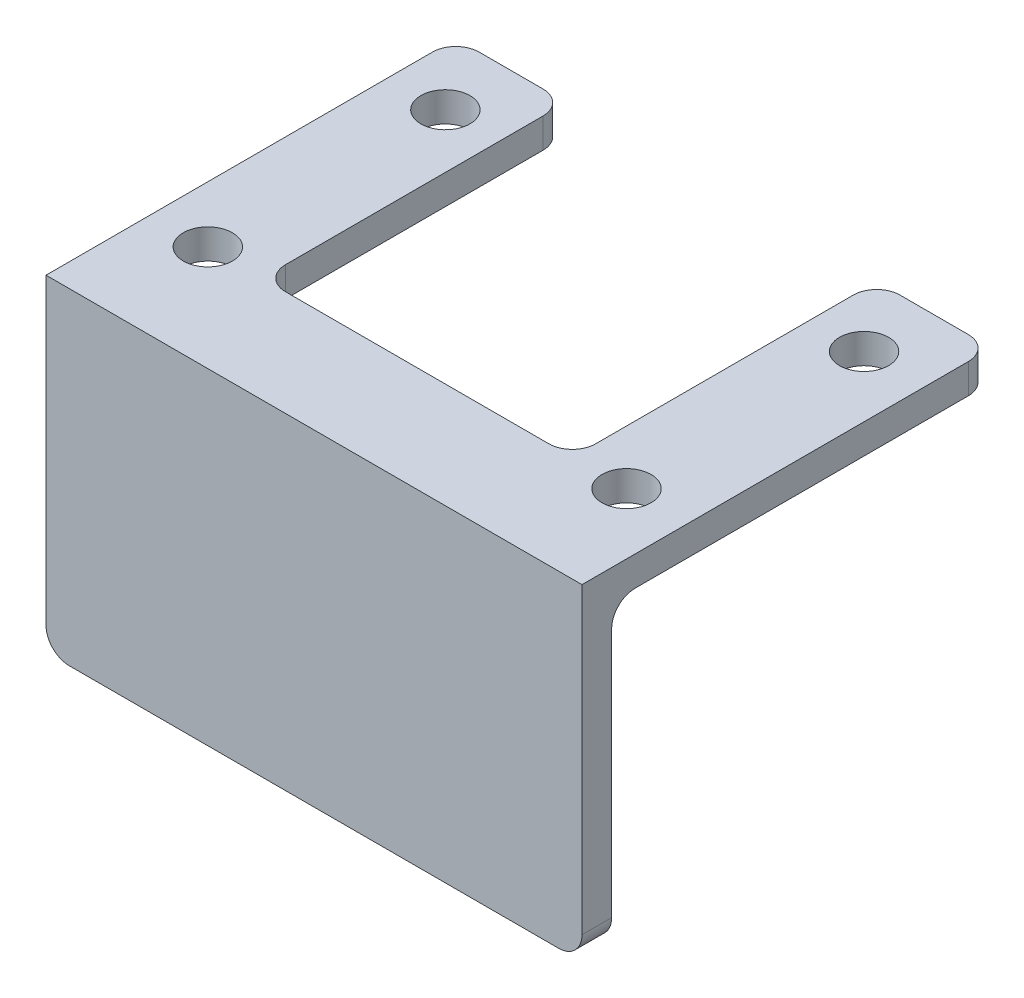
ISO-10303-21;
HEADER;
FILE_DESCRIPTION(('STEP AP214'),'2;1');
FILE_NAME('part.step','',(''),(''),'','','');
FILE_SCHEMA(('AUTOMOTIVE_DESIGN { 1 0 10303 214 1 1 1 1 }'));
ENDSEC;
DATA;
#1=APPLICATION_CONTEXT('core data for automotive mechanical design processes');
#2=APPLICATION_PROTOCOL_DEFINITION('international standard','automotive_design',2000,#1);
#3=PRODUCT_CONTEXT('',#1,'mechanical');
#4=PRODUCT('Part','Part','',(#3));
#5=PRODUCT_RELATED_PRODUCT_CATEGORY('part','',(#4));
#6=PRODUCT_DEFINITION_FORMATION('','',#4);
#7=PRODUCT_DEFINITION_CONTEXT('part definition',#1,'design');
#8=PRODUCT_DEFINITION('design','',#6,#7);
#9=PRODUCT_DEFINITION_SHAPE('','',#8);
#10=(LENGTH_UNIT() NAMED_UNIT(*) SI_UNIT(.MILLI.,.METRE.));
#11=(NAMED_UNIT(*) PLANE_ANGLE_UNIT() SI_UNIT($,.RADIAN.));
#12=(NAMED_UNIT(*) SI_UNIT($,.STERADIAN.) SOLID_ANGLE_UNIT());
#13=UNCERTAINTY_MEASURE_WITH_UNIT(LENGTH_MEASURE(1.E-05),#10,'distance_accuracy_value','');
#14=(GEOMETRIC_REPRESENTATION_CONTEXT(3) GLOBAL_UNCERTAINTY_ASSIGNED_CONTEXT((#13)) GLOBAL_UNIT_ASSIGNED_CONTEXT((#10,
#11,#12)) REPRESENTATION_CONTEXT('',''));
#15=CARTESIAN_POINT('',(0.,0.,0.));
#16=DIRECTION('',(0.,0.,1.));
#17=DIRECTION('',(1.,0.,0.));
#18=AXIS2_PLACEMENT_3D('',#15,#16,#17);
#19=CARTESIAN_POINT('',(0.,2.54,0.));
#20=DIRECTION('',(0.,1.,0.));
#21=DIRECTION('',(0.,0.,1.));
#22=AXIS2_PLACEMENT_3D('',#19,#20,#21);
#23=PLANE('',#22);
#24=CARTESIAN_POINT('',(56.209107250434,2.54,-23.3955963790764));
#25=DIRECTION('',(0.,1.,0.));
#26=DIRECTION('',(0.,0.,1.));
#27=AXIS2_PLACEMENT_3D('',#24,#25,#26);
#28=CIRCLE('',#27,2.09999999999999);
#29=CARTESIAN_POINT('',(56.209107250434,2.54,-21.2955963790764));
#30=VERTEX_POINT('',#29);
#31=EDGE_CURVE('E229',#30,#30,#28,.T.);
#32=ORIENTED_EDGE('',*,*,#31,.F.);
#33=EDGE_LOOP('',(#32));
#34=FACE_BOUND('',#33,.T.);
#35=CARTESIAN_POINT('',(20.395107250434,2.54,-23.3955963790764));
#36=DIRECTION('',(0.,1.,0.));
#37=DIRECTION('',(0.,0.,1.));
#38=AXIS2_PLACEMENT_3D('',#35,#36,#37);
#39=CIRCLE('',#38,2.1);
#40=CARTESIAN_POINT('',(20.395107250434,2.54,-21.2955963790764));
#41=VERTEX_POINT('',#40);
#42=EDGE_CURVE('E245',#41,#41,#39,.T.);
#43=ORIENTED_EDGE('',*,*,#42,.F.);
#44=EDGE_LOOP('',(#43));
#45=FACE_BOUND('',#44,.T.);
#46=DIRECTION('',(0.,0.,-1.));
#47=VECTOR('',#46,1.);
#48=CARTESIAN_POINT('',(61.4161118891041,2.54,3.40140328523063));
#49=LINE('',#48,#47);
#50=CARTESIAN_POINT('',(61.4161118891041,2.54,5.94140328523064));
#51=VERTEX_POINT('',#50);
#52=CARTESIAN_POINT('',(61.4161118891041,2.54,-27.1105972946034));
#53=VERTEX_POINT('',#52);
#54=EDGE_CURVE('E174',#51,#53,#49,.T.);
#55=ORIENTED_EDGE('',*,*,#54,.T.);
#56=CARTESIAN_POINT('',(59.4161118891041,2.54,-27.1105972946034));
#57=DIRECTION('',(0.,1.,0.));
#58=DIRECTION('',(0.,0.,1.));
#59=AXIS2_PLACEMENT_3D('',#56,#57,#58);
#60=CIRCLE('',#59,2.);
#61=CARTESIAN_POINT('',(59.4161118891041,2.54,-29.1105972946034));
#62=VERTEX_POINT('',#61);
#63=EDGE_CURVE('E362',#53,#62,#60,.T.);
#64=ORIENTED_EDGE('',*,*,#63,.T.);
#65=DIRECTION('',(-1.,0.,0.));
#66=VECTOR('',#65,1.);
#67=CARTESIAN_POINT('',(51.5691072504341,2.54,-29.1105972946034));
#68=LINE('',#67,#66);
#69=CARTESIAN_POINT('',(53.5691072504341,2.54,-29.1105972946034));
#70=VERTEX_POINT('',#69);
#71=EDGE_CURVE('E185',#62,#70,#68,.T.);
#72=ORIENTED_EDGE('',*,*,#71,.T.);
#73=CARTESIAN_POINT('',(53.5691072504341,2.54,-27.1105972946034));
#74=DIRECTION('',(0.,1.,0.));
#75=DIRECTION('',(0.,0.,1.));
#76=AXIS2_PLACEMENT_3D('',#73,#74,#75);
#77=CIRCLE('',#76,2.);
#78=CARTESIAN_POINT('',(51.5691072504341,2.54,-27.1105972946034));
#79=VERTEX_POINT('',#78);
#80=EDGE_CURVE('E359',#70,#79,#77,.T.);
#81=ORIENTED_EDGE('',*,*,#80,.T.);
#82=DIRECTION('',(0.,0.,1.));
#83=VECTOR('',#82,1.);
#84=CARTESIAN_POINT('',(51.5691072504341,2.54,-29.1105972946034));
#85=LINE('',#84,#83);
#86=CARTESIAN_POINT('',(51.5691072504341,2.54,-5.07559637907637));
#87=VERTEX_POINT('',#86);
#88=EDGE_CURVE('E259',#79,#87,#85,.T.);
#89=ORIENTED_EDGE('',*,*,#88,.T.);
#90=CARTESIAN_POINT('',(49.5691072504341,2.54,-5.07559637907637));
#91=DIRECTION('',(0.,1.,0.));
#92=DIRECTION('',(0.,0.,1.));
#93=AXIS2_PLACEMENT_3D('',#90,#91,#92);
#94=CIRCLE('',#93,2.);
#95=CARTESIAN_POINT('',(49.5691072504341,2.54,-3.07559637907637));
#96=VERTEX_POINT('',#95);
#97=EDGE_CURVE('E401',#87,#96,#94,.F.);
#98=ORIENTED_EDGE('',*,*,#97,.T.);
#99=DIRECTION('',(-1.,0.,0.));
#100=VECTOR('',#99,1.);
#101=CARTESIAN_POINT('',(25.035107250434,2.54,-3.07559637907637));
#102=LINE('',#101,#100);
#103=CARTESIAN_POINT('',(27.0351072504341,2.54,-3.07559637907637));
#104=VERTEX_POINT('',#103);
#105=EDGE_CURVE('E263',#96,#104,#102,.T.);
#106=ORIENTED_EDGE('',*,*,#105,.T.);
#107=CARTESIAN_POINT('',(27.0351072504341,2.54,-5.07559637907637));
#108=DIRECTION('',(0.,1.,0.));
#109=DIRECTION('',(0.,0.,1.));
#110=AXIS2_PLACEMENT_3D('',#107,#108,#109);
#111=CIRCLE('',#110,2.);
#112=CARTESIAN_POINT('',(25.035107250434,2.54,-5.07559637907637));
#113=VERTEX_POINT('',#112);
#114=EDGE_CURVE('E11',#104,#113,#111,.F.);
#115=ORIENTED_EDGE('',*,*,#114,.T.);
#116=DIRECTION('',(0.,0.,-1.));
#117=VECTOR('',#116,1.);
#118=CARTESIAN_POINT('',(25.035107250434,2.54,-29.1105972946034));
#119=LINE('',#118,#117);
#120=CARTESIAN_POINT('',(25.035107250434,2.54,-27.1105972946034));
#121=VERTEX_POINT('',#120);
#122=EDGE_CURVE('E267',#113,#121,#119,.T.);
#123=ORIENTED_EDGE('',*,*,#122,.T.);
#124=CARTESIAN_POINT('',(23.035107250434,2.54,-27.1105972946034));
#125=DIRECTION('',(0.,1.,0.));
#126=DIRECTION('',(0.,0.,1.));
#127=AXIS2_PLACEMENT_3D('',#124,#125,#126);
#128=CIRCLE('',#127,2.);
#129=CARTESIAN_POINT('',(23.035107250434,2.54,-29.1105972946034));
#130=VERTEX_POINT('',#129);
#131=EDGE_CURVE('E64',#121,#130,#128,.T.);
#132=ORIENTED_EDGE('',*,*,#131,.T.);
#133=DIRECTION('',(-1.,0.,0.));
#134=VECTOR('',#133,1.);
#135=CARTESIAN_POINT('',(15.5691041376411,2.54,-29.1105972946034));
#136=LINE('',#135,#134);
#137=CARTESIAN_POINT('',(17.569104137641,2.54,-29.1105972946034));
#138=VERTEX_POINT('',#137);
#139=EDGE_CURVE('E270',#130,#138,#136,.T.);
#140=ORIENTED_EDGE('',*,*,#139,.T.);
#141=CARTESIAN_POINT('',(17.569104137641,2.54,-27.1105972946034));
#142=DIRECTION('',(0.,1.,0.));
#143=DIRECTION('',(0.,0.,1.));
#144=AXIS2_PLACEMENT_3D('',#141,#142,#143);
#145=CIRCLE('',#144,2.);
#146=CARTESIAN_POINT('',(15.5691041376411,2.54,-27.1105972946034));
#147=VERTEX_POINT('',#146);
#148=EDGE_CURVE('E354',#138,#147,#145,.T.);
#149=ORIENTED_EDGE('',*,*,#148,.T.);
#150=DIRECTION('',(0.,0.,1.));
#151=VECTOR('',#150,1.);
#152=CARTESIAN_POINT('',(15.5691041376411,2.54,-29.1105972946034));
#153=LINE('',#152,#151);
#154=CARTESIAN_POINT('',(15.5691041376411,2.54,5.94140328523064));
#155=VERTEX_POINT('',#154);
#156=EDGE_CURVE('E186',#147,#155,#153,.T.);
#157=ORIENTED_EDGE('',*,*,#156,.T.);
#158=DIRECTION('',(-1.,0.,0.));
#159=VECTOR('',#158,1.);
#160=CARTESIAN_POINT('',(15.5691041376411,2.54,5.94140328523064));
#161=LINE('',#160,#159);
#162=EDGE_CURVE('E192',#51,#155,#161,.T.);
#163=ORIENTED_EDGE('',*,*,#162,.F.);
#164=EDGE_LOOP('',(#55,#64,#72,#81,#89,#98,#106,#115,#123,#132,#140,#149,#157,#163));
#165=FACE_BOUND('',#164,.T.);
#166=CARTESIAN_POINT('',(20.395107250434,2.54,-3.07559637907637));
#167=DIRECTION('',(0.,1.,0.));
#168=DIRECTION('',(0.,0.,1.));
#169=AXIS2_PLACEMENT_3D('',#166,#167,#168);
#170=CIRCLE('',#169,2.1);
#171=CARTESIAN_POINT('',(20.395107250434,2.54,-0.975596379076362));
#172=VERTEX_POINT('',#171);
#173=EDGE_CURVE('E237',#172,#172,#170,.T.);
#174=ORIENTED_EDGE('',*,*,#173,.F.);
#175=EDGE_LOOP('',(#174));
#176=FACE_BOUND('',#175,.T.);
#177=CARTESIAN_POINT('',(56.209107250434,2.54,-3.07559637907637));
#178=DIRECTION('',(0.,1.,0.));
#179=DIRECTION('',(0.,0.,1.));
#180=AXIS2_PLACEMENT_3D('',#177,#178,#179);
#181=CIRCLE('',#180,2.09999999999999);
#182=CARTESIAN_POINT('',(56.209107250434,2.54,-0.975596379076378));
#183=VERTEX_POINT('',#182);
#184=EDGE_CURVE('E221',#183,#183,#181,.T.);
#185=ORIENTED_EDGE('',*,*,#184,.F.);
#186=EDGE_LOOP('',(#185));
#187=FACE_BOUND('',#186,.T.);
#188=ADVANCED_FACE('F41',(#34,#45,#165,#176,#187),#23,.T.);
#189=CARTESIAN_POINT('',(0.,0.,0.));
#190=DIRECTION('',(0.,1.,0.));
#191=DIRECTION('',(0.,0.,1.));
#192=AXIS2_PLACEMENT_3D('',#189,#190,#191);
#193=PLANE('',#192);
#194=DIRECTION('',(0.,0.,-1.));
#195=VECTOR('',#194,1.);
#196=CARTESIAN_POINT('',(61.4161118891041,0.,-29.1105972946034));
#197=LINE('',#196,#195);
#198=CARTESIAN_POINT('',(61.4161118891041,0.,1.40140328523063));
#199=VERTEX_POINT('',#198);
#200=CARTESIAN_POINT('',(61.4161118891041,0.,-27.1105972946034));
#201=VERTEX_POINT('',#200);
#202=EDGE_CURVE('E277',#199,#201,#197,.T.);
#203=ORIENTED_EDGE('',*,*,#202,.F.);
#204=DIRECTION('',(1.,0.,0.));
#205=VECTOR('',#204,1.);
#206=CARTESIAN_POINT('',(0.,0.,1.40140328523064));
#207=LINE('',#206,#205);
#208=CARTESIAN_POINT('',(15.569104137641,0.,1.40140328523064));
#209=VERTEX_POINT('',#208);
#210=EDGE_CURVE('E344',#199,#209,#207,.F.);
#211=ORIENTED_EDGE('',*,*,#210,.T.);
#212=DIRECTION('',(0.,0.,1.));
#213=VECTOR('',#212,1.);
#214=CARTESIAN_POINT('',(15.5691041376411,0.,2.13140328523063));
#215=LINE('',#214,#213);
#216=CARTESIAN_POINT('',(15.569104137641,0.,-27.1105972946034));
#217=VERTEX_POINT('',#216);
#218=EDGE_CURVE('E249',#217,#209,#215,.T.);
#219=ORIENTED_EDGE('',*,*,#218,.F.);
#220=CARTESIAN_POINT('',(17.569104137641,0.,-27.1105972946034));
#221=DIRECTION('',(0.,1.,0.));
#222=DIRECTION('',(0.,0.,1.));
#223=AXIS2_PLACEMENT_3D('',#220,#221,#222);
#224=CIRCLE('',#223,2.);
#225=CARTESIAN_POINT('',(17.569104137641,0.,-29.1105972946034));
#226=VERTEX_POINT('',#225);
#227=EDGE_CURVE('E332',#217,#226,#224,.F.);
#228=ORIENTED_EDGE('',*,*,#227,.T.);
#229=DIRECTION('',(-1.,0.,0.));
#230=VECTOR('',#229,1.);
#231=CARTESIAN_POINT('',(15.5691041376411,0.,-29.1105972946034));
#232=LINE('',#231,#230);
#233=CARTESIAN_POINT('',(23.035107250434,0.,-29.1105972946034));
#234=VERTEX_POINT('',#233);
#235=EDGE_CURVE('E254',#234,#226,#232,.T.);
#236=ORIENTED_EDGE('',*,*,#235,.F.);
#237=CARTESIAN_POINT('',(23.035107250434,0.,-27.1105972946034));
#238=DIRECTION('',(0.,1.,0.));
#239=DIRECTION('',(0.,0.,1.));
#240=AXIS2_PLACEMENT_3D('',#237,#238,#239);
#241=CIRCLE('',#240,2.);
#242=CARTESIAN_POINT('',(25.035107250434,0.,-27.1105972946034));
#243=VERTEX_POINT('',#242);
#244=EDGE_CURVE('E335',#234,#243,#241,.F.);
#245=ORIENTED_EDGE('',*,*,#244,.T.);
#246=DIRECTION('',(0.,0.,-1.));
#247=VECTOR('',#246,1.);
#248=CARTESIAN_POINT('',(25.035107250434,0.,-29.1105972946034));
#249=LINE('',#248,#247);
#250=CARTESIAN_POINT('',(25.035107250434,0.,-5.07559637907637));
#251=VERTEX_POINT('',#250);
#252=EDGE_CURVE('E292',#251,#243,#249,.T.);
#253=ORIENTED_EDGE('',*,*,#252,.F.);
#254=CARTESIAN_POINT('',(27.0351072504341,0.,-5.07559637907637));
#255=DIRECTION('',(0.,1.,0.));
#256=DIRECTION('',(0.,0.,1.));
#257=AXIS2_PLACEMENT_3D('',#254,#255,#256);
#258=CIRCLE('',#257,2.);
#259=CARTESIAN_POINT('',(27.0351072504341,0.,-3.07559637907637));
#260=VERTEX_POINT('',#259);
#261=EDGE_CURVE('E50',#251,#260,#258,.T.);
#262=ORIENTED_EDGE('',*,*,#261,.T.);
#263=DIRECTION('',(-1.,0.,0.));
#264=VECTOR('',#263,1.);
#265=CARTESIAN_POINT('',(25.035107250434,0.,-3.07559637907637));
#266=LINE('',#265,#264);
#267=CARTESIAN_POINT('',(49.5691072504341,0.,-3.07559637907637));
#268=VERTEX_POINT('',#267);
#269=EDGE_CURVE('E288',#268,#260,#266,.T.);
#270=ORIENTED_EDGE('',*,*,#269,.F.);
#271=CARTESIAN_POINT('',(49.5691072504341,0.,-5.07559637907637));
#272=DIRECTION('',(0.,1.,0.));
#273=DIRECTION('',(0.,0.,1.));
#274=AXIS2_PLACEMENT_3D('',#271,#272,#273);
#275=CIRCLE('',#274,2.);
#276=CARTESIAN_POINT('',(51.5691072504341,0.,-5.07559637907637));
#277=VERTEX_POINT('',#276);
#278=EDGE_CURVE('E398',#268,#277,#275,.T.);
#279=ORIENTED_EDGE('',*,*,#278,.T.);
#280=DIRECTION('',(0.,0.,1.));
#281=VECTOR('',#280,1.);
#282=CARTESIAN_POINT('',(51.5691072504341,0.,-29.1105972946034));
#283=LINE('',#282,#281);
#284=CARTESIAN_POINT('',(51.5691072504341,0.,-27.1105972946034));
#285=VERTEX_POINT('',#284);
#286=EDGE_CURVE('E284',#285,#277,#283,.T.);
#287=ORIENTED_EDGE('',*,*,#286,.F.);
#288=CARTESIAN_POINT('',(53.5691072504341,0.,-27.1105972946034));
#289=DIRECTION('',(0.,1.,0.));
#290=DIRECTION('',(0.,0.,1.));
#291=AXIS2_PLACEMENT_3D('',#288,#289,#290);
#292=CIRCLE('',#291,2.);
#293=CARTESIAN_POINT('',(53.5691072504341,0.,-29.1105972946034));
#294=VERTEX_POINT('',#293);
#295=EDGE_CURVE('E338',#285,#294,#292,.F.);
#296=ORIENTED_EDGE('',*,*,#295,.T.);
#297=DIRECTION('',(-1.,0.,0.));
#298=VECTOR('',#297,1.);
#299=CARTESIAN_POINT('',(51.5691072504341,0.,-29.1105972946034));
#300=LINE('',#299,#298);
#301=CARTESIAN_POINT('',(59.4161118891041,0.,-29.1105972946034));
#302=VERTEX_POINT('',#301);
#303=EDGE_CURVE('E280',#302,#294,#300,.T.);
#304=ORIENTED_EDGE('',*,*,#303,.F.);
#305=CARTESIAN_POINT('',(59.4161118891041,0.,-27.1105972946034));
#306=DIRECTION('',(0.,1.,0.));
#307=DIRECTION('',(0.,0.,1.));
#308=AXIS2_PLACEMENT_3D('',#305,#306,#307);
#309=CIRCLE('',#308,2.);
#310=EDGE_CURVE('E341',#302,#201,#309,.F.);
#311=ORIENTED_EDGE('',*,*,#310,.T.);
#312=EDGE_LOOP('',(#203,#211,#219,#228,#236,#245,#253,#262,#270,#279,#287,#296,#304,#311));
#313=FACE_BOUND('',#312,.T.);
#314=CARTESIAN_POINT('',(20.395107250434,0.,-23.3955963790764));
#315=DIRECTION('',(0.,1.,0.));
#316=DIRECTION('',(0.,0.,1.));
#317=AXIS2_PLACEMENT_3D('',#314,#315,#316);
#318=CIRCLE('',#317,2.1);
#319=CARTESIAN_POINT('',(20.395107250434,0.,-21.2955963790764));
#320=VERTEX_POINT('',#319);
#321=EDGE_CURVE('E241',#320,#320,#318,.T.);
#322=ORIENTED_EDGE('',*,*,#321,.T.);
#323=EDGE_LOOP('',(#322));
#324=FACE_BOUND('',#323,.T.);
#325=CARTESIAN_POINT('',(20.395107250434,0.,-3.07559637907637));
#326=DIRECTION('',(0.,1.,0.));
#327=DIRECTION('',(0.,0.,1.));
#328=AXIS2_PLACEMENT_3D('',#325,#326,#327);
#329=CIRCLE('',#328,2.1);
#330=CARTESIAN_POINT('',(20.395107250434,0.,-0.975596379076362));
#331=VERTEX_POINT('',#330);
#332=EDGE_CURVE('E233',#331,#331,#329,.T.);
#333=ORIENTED_EDGE('',*,*,#332,.T.);
#334=EDGE_LOOP('',(#333));
#335=FACE_BOUND('',#334,.T.);
#336=CARTESIAN_POINT('',(56.209107250434,0.,-23.3955963790764));
#337=DIRECTION('',(0.,1.,0.));
#338=DIRECTION('',(0.,0.,1.));
#339=AXIS2_PLACEMENT_3D('',#336,#337,#338);
#340=CIRCLE('',#339,2.09999999999999);
#341=CARTESIAN_POINT('',(56.209107250434,0.,-21.2955963790764));
#342=VERTEX_POINT('',#341);
#343=EDGE_CURVE('E225',#342,#342,#340,.T.);
#344=ORIENTED_EDGE('',*,*,#343,.T.);
#345=EDGE_LOOP('',(#344));
#346=FACE_BOUND('',#345,.T.);
#347=CARTESIAN_POINT('',(56.209107250434,0.,-3.07559637907637));
#348=DIRECTION('',(0.,1.,0.));
#349=DIRECTION('',(0.,0.,1.));
#350=AXIS2_PLACEMENT_3D('',#347,#348,#349);
#351=CIRCLE('',#350,2.09999999999999);
#352=CARTESIAN_POINT('',(56.209107250434,0.,-0.975596379076378));
#353=VERTEX_POINT('',#352);
#354=EDGE_CURVE('E216',#353,#353,#351,.T.);
#355=ORIENTED_EDGE('',*,*,#354,.T.);
#356=EDGE_LOOP('',(#355));
#357=FACE_BOUND('',#356,.T.);
#358=ADVANCED_FACE('F408',(#313,#324,#335,#346,#357),#193,.F.);
#359=CARTESIAN_POINT('',(15.5691041376411,2.54,2.13140328523063));
#360=DIRECTION('',(1.,0.,0.));
#361=DIRECTION('',(0.,0.,-1.));
#362=AXIS2_PLACEMENT_3D('',#359,#360,#361);
#363=PLANE('',#362);
#364=DIRECTION('',(0.,-1.,0.));
#365=VECTOR('',#364,1.);
#366=CARTESIAN_POINT('',(15.5691041376411,2.54,3.40140328523063));
#367=LINE('',#366,#365);
#368=CARTESIAN_POINT('',(15.5691041376411,-2.,3.40140328523063));
#369=VERTEX_POINT('',#368);
#370=CARTESIAN_POINT('',(15.5691041376411,-23.4,3.40140328523063));
#371=VERTEX_POINT('',#370);
#372=EDGE_CURVE('E203',#369,#371,#367,.T.);
#373=ORIENTED_EDGE('',*,*,#372,.T.);
#374=DIRECTION('',(0.,0.,-1.));
#375=VECTOR('',#374,1.);
#376=CARTESIAN_POINT('',(15.5691041376411,-23.4,2.13140328523063));
#377=LINE('',#376,#375);
#378=CARTESIAN_POINT('',(15.5691041376411,-23.4,5.94140328523064));
#379=VERTEX_POINT('',#378);
#380=EDGE_CURVE('E319',#371,#379,#377,.F.);
#381=ORIENTED_EDGE('',*,*,#380,.T.);
#382=DIRECTION('',(0.,-1.,0.));
#383=VECTOR('',#382,1.);
#384=CARTESIAN_POINT('',(15.5691041376411,2.54,5.94140328523064));
#385=LINE('',#384,#383);
#386=EDGE_CURVE('E196',#155,#379,#385,.T.);
#387=ORIENTED_EDGE('',*,*,#386,.F.);
#388=ORIENTED_EDGE('',*,*,#156,.F.);
#389=DIRECTION('',(0.,-1.,0.));
#390=VECTOR('',#389,1.);
#391=CARTESIAN_POINT('',(15.569104137641,2.54,-27.1105972946034));
#392=LINE('',#391,#390);
#393=EDGE_CURVE('E315',#147,#217,#392,.T.);
#394=ORIENTED_EDGE('',*,*,#393,.T.);
#395=ORIENTED_EDGE('',*,*,#218,.T.);
#396=CARTESIAN_POINT('',(15.569104137641,-2.,1.40140328523064));
#397=DIRECTION('',(1.,0.,0.));
#398=DIRECTION('',(0.,0.,-1.));
#399=AXIS2_PLACEMENT_3D('',#396,#397,#398);
#400=CIRCLE('',#399,2.);
#401=EDGE_CURVE('E395',#209,#369,#400,.T.);
#402=ORIENTED_EDGE('',*,*,#401,.T.);
#403=EDGE_LOOP('',(#373,#381,#387,#388,#394,#395,#402));
#404=FACE_BOUND('',#403,.T.);
#405=ADVANCED_FACE('F433',(#404),#363,.F.);
#406=CARTESIAN_POINT('',(61.4161118891041,2.54,-29.1105972946034));
#407=DIRECTION('',(-1.,0.,0.));
#408=DIRECTION('',(0.,0.,1.));
#409=AXIS2_PLACEMENT_3D('',#406,#407,#408);
#410=PLANE('',#409);
#411=DIRECTION('',(0.,-1.,0.));
#412=VECTOR('',#411,1.);
#413=CARTESIAN_POINT('',(61.4161118891041,2.54,5.94140328523064));
#414=LINE('',#413,#412);
#415=CARTESIAN_POINT('',(61.4161118891041,-23.4,5.94140328523064));
#416=VERTEX_POINT('',#415);
#417=EDGE_CURVE('E177',#51,#416,#414,.T.);
#418=ORIENTED_EDGE('',*,*,#417,.T.);
#419=DIRECTION('',(0.,0.,1.));
#420=VECTOR('',#419,1.);
#421=CARTESIAN_POINT('',(61.4161118891041,-23.4,-29.1105972946034));
#422=LINE('',#421,#420);
#423=CARTESIAN_POINT('',(61.4161118891041,-23.4,3.40140328523063));
#424=VERTEX_POINT('',#423);
#425=EDGE_CURVE('E329',#416,#424,#422,.F.);
#426=ORIENTED_EDGE('',*,*,#425,.T.);
#427=DIRECTION('',(0.,-1.,0.));
#428=VECTOR('',#427,1.);
#429=CARTESIAN_POINT('',(61.4161118891041,2.54,3.40140328523063));
#430=LINE('',#429,#428);
#431=CARTESIAN_POINT('',(61.4161118891041,-2.,3.40140328523063));
#432=VERTEX_POINT('',#431);
#433=EDGE_CURVE('E197',#432,#424,#430,.T.);
#434=ORIENTED_EDGE('',*,*,#433,.F.);
#435=CARTESIAN_POINT('',(61.4161118891041,-2.,1.40140328523064));
#436=DIRECTION('',(-1.,0.,0.));
#437=DIRECTION('',(0.,0.,1.));
#438=AXIS2_PLACEMENT_3D('',#435,#436,#437);
#439=CIRCLE('',#438,2.);
#440=EDGE_CURVE('E392',#432,#199,#439,.T.);
#441=ORIENTED_EDGE('',*,*,#440,.T.);
#442=ORIENTED_EDGE('',*,*,#202,.T.);
#443=DIRECTION('',(0.,-1.,0.));
#444=VECTOR('',#443,1.);
#445=CARTESIAN_POINT('',(61.4161118891041,2.54,-27.1105972946034));
#446=LINE('',#445,#444);
#447=EDGE_CURVE('E181',#201,#53,#446,.F.);
#448=ORIENTED_EDGE('',*,*,#447,.T.);
#449=ORIENTED_EDGE('',*,*,#54,.F.);
#450=EDGE_LOOP('',(#418,#426,#434,#441,#442,#448,#449));
#451=FACE_BOUND('',#450,.T.);
#452=ADVANCED_FACE('F176',(#451),#410,.F.);
#453=CARTESIAN_POINT('',(51.5691072504341,2.54,-29.1105972946034));
#454=DIRECTION('',(0.,0.,1.));
#455=DIRECTION('',(1.,0.,0.));
#456=AXIS2_PLACEMENT_3D('',#453,#454,#455);
#457=PLANE('',#456);
#458=ORIENTED_EDGE('',*,*,#71,.F.);
#459=DIRECTION('',(0.,-1.,0.));
#460=VECTOR('',#459,1.);
#461=CARTESIAN_POINT('',(59.4161118891041,2.54,-29.1105972946034));
#462=LINE('',#461,#460);
#463=EDGE_CURVE('E350',#62,#302,#462,.T.);
#464=ORIENTED_EDGE('',*,*,#463,.T.);
#465=ORIENTED_EDGE('',*,*,#303,.T.);
#466=DIRECTION('',(0.,-1.,0.));
#467=VECTOR('',#466,1.);
#468=CARTESIAN_POINT('',(53.5691072504341,2.54,-29.1105972946034));
#469=LINE('',#468,#467);
#470=EDGE_CURVE('E347',#294,#70,#469,.F.);
#471=ORIENTED_EDGE('',*,*,#470,.T.);
#472=EDGE_LOOP('',(#458,#464,#465,#471));
#473=FACE_BOUND('',#472,.T.);
#474=ADVANCED_FACE('F491',(#473),#457,.F.);
#475=CARTESIAN_POINT('',(51.5691072504341,2.54,-29.1105972946034));
#476=DIRECTION('',(1.,0.,0.));
#477=DIRECTION('',(0.,0.,-1.));
#478=AXIS2_PLACEMENT_3D('',#475,#476,#477);
#479=PLANE('',#478);
#480=ORIENTED_EDGE('',*,*,#88,.F.);
#481=DIRECTION('',(0.,-1.,0.));
#482=VECTOR('',#481,1.);
#483=CARTESIAN_POINT('',(51.5691072504341,2.54,-27.1105972946034));
#484=LINE('',#483,#482);
#485=EDGE_CURVE('E368',#79,#285,#484,.T.);
#486=ORIENTED_EDGE('',*,*,#485,.T.);
#487=ORIENTED_EDGE('',*,*,#286,.T.);
#488=DIRECTION('',(0.,-1.,0.));
#489=VECTOR('',#488,1.);
#490=CARTESIAN_POINT('',(51.5691072504341,2.54,-5.07559637907637));
#491=LINE('',#490,#489);
#492=EDGE_CURVE('E365',#277,#87,#491,.F.);
#493=ORIENTED_EDGE('',*,*,#492,.T.);
#494=EDGE_LOOP('',(#480,#486,#487,#493));
#495=FACE_BOUND('',#494,.T.);
#496=ADVANCED_FACE('F488',(#495),#479,.F.);
#497=CARTESIAN_POINT('',(25.035107250434,2.54,-3.07559637907637));
#498=DIRECTION('',(0.,0.,1.));
#499=DIRECTION('',(1.,0.,0.));
#500=AXIS2_PLACEMENT_3D('',#497,#498,#499);
#501=PLANE('',#500);
#502=ORIENTED_EDGE('',*,*,#105,.F.);
#503=DIRECTION('',(0.,-1.,0.));
#504=VECTOR('',#503,1.);
#505=CARTESIAN_POINT('',(49.5691072504341,0.,-3.07559637907637));
#506=LINE('',#505,#504);
#507=EDGE_CURVE('E375',#96,#268,#506,.T.);
#508=ORIENTED_EDGE('',*,*,#507,.T.);
#509=ORIENTED_EDGE('',*,*,#269,.T.);
#510=DIRECTION('',(0.,-1.,0.));
#511=VECTOR('',#510,1.);
#512=CARTESIAN_POINT('',(27.0351072504341,2.54,-3.07559637907637));
#513=LINE('',#512,#511);
#514=EDGE_CURVE('E372',#260,#104,#513,.F.);
#515=ORIENTED_EDGE('',*,*,#514,.T.);
#516=EDGE_LOOP('',(#502,#508,#509,#515));
#517=FACE_BOUND('',#516,.T.);
#518=ADVANCED_FACE('F415',(#517),#501,.F.);
#519=CARTESIAN_POINT('',(25.035107250434,2.54,-29.1105972946034));
#520=DIRECTION('',(-1.,0.,0.));
#521=DIRECTION('',(0.,0.,1.));
#522=AXIS2_PLACEMENT_3D('',#519,#520,#521);
#523=PLANE('',#522);
#524=ORIENTED_EDGE('',*,*,#122,.F.);
#525=DIRECTION('',(0.,-1.,0.));
#526=VECTOR('',#525,1.);
#527=CARTESIAN_POINT('',(25.035107250434,0.,-5.07559637907637));
#528=LINE('',#527,#526);
#529=EDGE_CURVE('E382',#113,#251,#528,.T.);
#530=ORIENTED_EDGE('',*,*,#529,.T.);
#531=ORIENTED_EDGE('',*,*,#252,.T.);
#532=DIRECTION('',(0.,-1.,0.));
#533=VECTOR('',#532,1.);
#534=CARTESIAN_POINT('',(25.035107250434,2.54,-27.1105972946034));
#535=LINE('',#534,#533);
#536=EDGE_CURVE('E379',#243,#121,#535,.F.);
#537=ORIENTED_EDGE('',*,*,#536,.T.);
#538=EDGE_LOOP('',(#524,#530,#531,#537));
#539=FACE_BOUND('',#538,.T.);
#540=ADVANCED_FACE('F421',(#539),#523,.F.);
#541=CARTESIAN_POINT('',(15.5691041376411,2.54,-29.1105972946034));
#542=DIRECTION('',(0.,0.,1.));
#543=DIRECTION('',(1.,0.,0.));
#544=AXIS2_PLACEMENT_3D('',#541,#542,#543);
#545=PLANE('',#544);
#546=ORIENTED_EDGE('',*,*,#139,.F.);
#547=DIRECTION('',(0.,-1.,0.));
#548=VECTOR('',#547,1.);
#549=CARTESIAN_POINT('',(23.035107250434,2.54,-29.1105972946034));
#550=LINE('',#549,#548);
#551=EDGE_CURVE('E388',#130,#234,#550,.T.);
#552=ORIENTED_EDGE('',*,*,#551,.T.);
#553=ORIENTED_EDGE('',*,*,#235,.T.);
#554=DIRECTION('',(0.,-1.,0.));
#555=VECTOR('',#554,1.);
#556=CARTESIAN_POINT('',(17.569104137641,2.54,-29.1105972946034));
#557=LINE('',#556,#555);
#558=EDGE_CURVE('E57',#226,#138,#557,.F.);
#559=ORIENTED_EDGE('',*,*,#558,.T.);
#560=EDGE_LOOP('',(#546,#552,#553,#559));
#561=FACE_BOUND('',#560,.T.);
#562=ADVANCED_FACE('F427',(#561),#545,.F.);
#563=CARTESIAN_POINT('',(20.395107250434,2.54,-23.3955963790764));
#564=DIRECTION('',(0.,-1.,0.));
#565=DIRECTION('',(0.,0.,-1.));
#566=AXIS2_PLACEMENT_3D('',#563,#564,#565);
#567=CYLINDRICAL_SURFACE('',#566,2.1);
#568=ORIENTED_EDGE('',*,*,#42,.T.);
#569=EDGE_LOOP('',(#568));
#570=FACE_BOUND('',#569,.T.);
#571=ORIENTED_EDGE('',*,*,#321,.F.);
#572=EDGE_LOOP('',(#571));
#573=FACE_BOUND('',#572,.T.);
#574=ADVANCED_FACE('F479',(#570,#573),#567,.F.);
#575=CARTESIAN_POINT('',(20.395107250434,2.54,-3.07559637907637));
#576=DIRECTION('',(0.,-1.,0.));
#577=DIRECTION('',(0.,0.,-1.));
#578=AXIS2_PLACEMENT_3D('',#575,#576,#577);
#579=CYLINDRICAL_SURFACE('',#578,2.1);
#580=ORIENTED_EDGE('',*,*,#173,.T.);
#581=EDGE_LOOP('',(#580));
#582=FACE_BOUND('',#581,.T.);
#583=ORIENTED_EDGE('',*,*,#332,.F.);
#584=EDGE_LOOP('',(#583));
#585=FACE_BOUND('',#584,.T.);
#586=ADVANCED_FACE('F518',(#582,#585),#579,.F.);
#587=CARTESIAN_POINT('',(56.209107250434,2.54,-23.3955963790764));
#588=DIRECTION('',(0.,-1.,0.));
#589=DIRECTION('',(0.,0.,-1.));
#590=AXIS2_PLACEMENT_3D('',#587,#588,#589);
#591=CYLINDRICAL_SURFACE('',#590,2.09999999999999);
#592=ORIENTED_EDGE('',*,*,#31,.T.);
#593=EDGE_LOOP('',(#592));
#594=FACE_BOUND('',#593,.T.);
#595=ORIENTED_EDGE('',*,*,#343,.F.);
#596=EDGE_LOOP('',(#595));
#597=FACE_BOUND('',#596,.T.);
#598=ADVANCED_FACE('F515',(#594,#597),#591,.F.);
#599=CARTESIAN_POINT('',(56.209107250434,2.54,-3.07559637907637));
#600=DIRECTION('',(0.,-1.,0.));
#601=DIRECTION('',(0.,0.,-1.));
#602=AXIS2_PLACEMENT_3D('',#599,#600,#601);
#603=CYLINDRICAL_SURFACE('',#602,2.09999999999999);
#604=ORIENTED_EDGE('',*,*,#184,.T.);
#605=EDGE_LOOP('',(#604));
#606=FACE_BOUND('',#605,.T.);
#607=ORIENTED_EDGE('',*,*,#354,.F.);
#608=EDGE_LOOP('',(#607));
#609=FACE_BOUND('',#608,.T.);
#610=ADVANCED_FACE('F511',(#606,#609),#603,.F.);
#611=CARTESIAN_POINT('',(15.5691041376411,2.54,5.94140328523064));
#612=DIRECTION('',(0.,0.,1.));
#613=DIRECTION('',(1.,0.,0.));
#614=AXIS2_PLACEMENT_3D('',#611,#612,#613);
#615=PLANE('',#614);
#616=ORIENTED_EDGE('',*,*,#386,.T.);
#617=CARTESIAN_POINT('',(17.5691041376411,-23.4,5.94140328523064));
#618=DIRECTION('',(0.,0.,1.));
#619=DIRECTION('',(1.,0.,0.));
#620=AXIS2_PLACEMENT_3D('',#617,#618,#619);
#621=CIRCLE('',#620,2.);
#622=CARTESIAN_POINT('',(17.5691041376411,-25.4,5.94140328523064));
#623=VERTEX_POINT('',#622);
#624=EDGE_CURVE('E324',#379,#623,#621,.T.);
#625=ORIENTED_EDGE('',*,*,#624,.T.);
#626=DIRECTION('',(-1.,0.,0.));
#627=VECTOR('',#626,1.);
#628=CARTESIAN_POINT('',(15.5691041376411,-25.4,5.94140328523064));
#629=LINE('',#628,#627);
#630=CARTESIAN_POINT('',(59.4161118891041,-25.4,5.94140328523064));
#631=VERTEX_POINT('',#630);
#632=EDGE_CURVE('E204',#631,#623,#629,.T.);
#633=ORIENTED_EDGE('',*,*,#632,.F.);
#634=CARTESIAN_POINT('',(59.4161118891041,-23.4,5.94140328523064));
#635=DIRECTION('',(0.,0.,1.));
#636=DIRECTION('',(1.,0.,0.));
#637=AXIS2_PLACEMENT_3D('',#634,#635,#636);
#638=CIRCLE('',#637,2.);
#639=EDGE_CURVE('E194',#631,#416,#638,.T.);
#640=ORIENTED_EDGE('',*,*,#639,.T.);
#641=ORIENTED_EDGE('',*,*,#417,.F.);
#642=ORIENTED_EDGE('',*,*,#162,.T.);
#643=EDGE_LOOP('',(#616,#625,#633,#640,#641,#642));
#644=FACE_BOUND('',#643,.T.);
#645=ADVANCED_FACE('F191',(#644),#615,.T.);
#646=CARTESIAN_POINT('',(15.5691041376411,2.54,3.40140328523063));
#647=DIRECTION('',(0.,0.,-1.));
#648=DIRECTION('',(-1.,0.,0.));
#649=AXIS2_PLACEMENT_3D('',#646,#647,#648);
#650=PLANE('',#649);
#651=DIRECTION('',(1.,0.,0.));
#652=VECTOR('',#651,1.);
#653=CARTESIAN_POINT('',(15.5691041376411,-25.4,3.40140328523063));
#654=LINE('',#653,#652);
#655=CARTESIAN_POINT('',(17.5691041376411,-25.4,3.40140328523063));
#656=VERTEX_POINT('',#655);
#657=CARTESIAN_POINT('',(59.4161118891041,-25.4,3.40140328523063));
#658=VERTEX_POINT('',#657);
#659=EDGE_CURVE('E211',#656,#658,#654,.T.);
#660=ORIENTED_EDGE('',*,*,#659,.F.);
#661=CARTESIAN_POINT('',(17.5691041376411,-23.4,3.40140328523063));
#662=DIRECTION('',(0.,0.,-1.));
#663=DIRECTION('',(-1.,0.,0.));
#664=AXIS2_PLACEMENT_3D('',#661,#662,#663);
#665=CIRCLE('',#664,2.);
#666=EDGE_CURVE('E312',#656,#371,#665,.T.);
#667=ORIENTED_EDGE('',*,*,#666,.T.);
#668=ORIENTED_EDGE('',*,*,#372,.F.);
#669=DIRECTION('',(1.,0.,0.));
#670=VECTOR('',#669,1.);
#671=CARTESIAN_POINT('',(15.5691041376411,-2.,3.40140328523063));
#672=LINE('',#671,#670);
#673=EDGE_CURVE('E305',#369,#432,#672,.T.);
#674=ORIENTED_EDGE('',*,*,#673,.T.);
#675=ORIENTED_EDGE('',*,*,#433,.T.);
#676=CARTESIAN_POINT('',(59.4161118891041,-23.4,3.40140328523063));
#677=DIRECTION('',(0.,0.,-1.));
#678=DIRECTION('',(-1.,0.,0.));
#679=AXIS2_PLACEMENT_3D('',#676,#677,#678);
#680=CIRCLE('',#679,2.);
#681=EDGE_CURVE('E309',#424,#658,#680,.T.);
#682=ORIENTED_EDGE('',*,*,#681,.T.);
#683=EDGE_LOOP('',(#660,#667,#668,#674,#675,#682));
#684=FACE_BOUND('',#683,.T.);
#685=ADVANCED_FACE('F446',(#684),#650,.T.);
#686=CARTESIAN_POINT('',(0.,-25.4,0.));
#687=DIRECTION('',(0.,1.,0.));
#688=DIRECTION('',(0.,0.,1.));
#689=AXIS2_PLACEMENT_3D('',#686,#687,#688);
#690=PLANE('',#689);
#691=ORIENTED_EDGE('',*,*,#632,.T.);
#692=DIRECTION('',(0.,0.,-1.));
#693=VECTOR('',#692,1.);
#694=CARTESIAN_POINT('',(17.569104137641,-25.4,0.));
#695=LINE('',#694,#693);
#696=EDGE_CURVE('E301',#623,#656,#695,.T.);
#697=ORIENTED_EDGE('',*,*,#696,.T.);
#698=ORIENTED_EDGE('',*,*,#659,.T.);
#699=DIRECTION('',(0.,0.,1.));
#700=VECTOR('',#699,1.);
#701=CARTESIAN_POINT('',(59.4161118891041,-25.4,0.));
#702=LINE('',#701,#700);
#703=EDGE_CURVE('E273',#658,#631,#702,.T.);
#704=ORIENTED_EDGE('',*,*,#703,.T.);
#705=EDGE_LOOP('',(#691,#697,#698,#704));
#706=FACE_BOUND('',#705,.T.);
#707=ADVANCED_FACE('F443',(#706),#690,.F.);
#708=CARTESIAN_POINT('',(17.569104137641,-23.4,0.));
#709=DIRECTION('',(0.,0.,-1.));
#710=DIRECTION('',(-1.,0.,0.));
#711=AXIS2_PLACEMENT_3D('',#708,#709,#710);
#712=CYLINDRICAL_SURFACE('',#711,2.);
#713=ORIENTED_EDGE('',*,*,#624,.F.);
#714=ORIENTED_EDGE('',*,*,#380,.F.);
#715=ORIENTED_EDGE('',*,*,#666,.F.);
#716=ORIENTED_EDGE('',*,*,#696,.F.);
#717=EDGE_LOOP('',(#713,#714,#715,#716));
#718=FACE_BOUND('',#717,.T.);
#719=ADVANCED_FACE('F439',(#718),#712,.T.);
#720=CARTESIAN_POINT('',(59.4161118891041,-23.4,0.));
#721=DIRECTION('',(0.,0.,1.));
#722=DIRECTION('',(1.,0.,0.));
#723=AXIS2_PLACEMENT_3D('',#720,#721,#722);
#724=CYLINDRICAL_SURFACE('',#723,2.);
#725=ORIENTED_EDGE('',*,*,#681,.F.);
#726=ORIENTED_EDGE('',*,*,#425,.F.);
#727=ORIENTED_EDGE('',*,*,#639,.F.);
#728=ORIENTED_EDGE('',*,*,#703,.F.);
#729=EDGE_LOOP('',(#725,#726,#727,#728));
#730=FACE_BOUND('',#729,.T.);
#731=ADVANCED_FACE('F452',(#730),#724,.T.);
#732=CARTESIAN_POINT('',(15.5691041376411,-2.,1.40140328523064));
#733=DIRECTION('',(1.,0.,0.));
#734=DIRECTION('',(0.,0.,-1.));
#735=AXIS2_PLACEMENT_3D('',#732,#733,#734);
#736=CYLINDRICAL_SURFACE('',#735,2.);
#737=ORIENTED_EDGE('',*,*,#401,.F.);
#738=ORIENTED_EDGE('',*,*,#210,.F.);
#739=ORIENTED_EDGE('',*,*,#440,.F.);
#740=ORIENTED_EDGE('',*,*,#673,.F.);
#741=EDGE_LOOP('',(#737,#738,#739,#740));
#742=FACE_BOUND('',#741,.T.);
#743=ADVANCED_FACE('F457',(#742),#736,.F.);
#744=CARTESIAN_POINT('',(59.4161118891041,2.54,-27.1105972946034));
#745=DIRECTION('',(0.,-1.,0.));
#746=DIRECTION('',(0.,0.,-1.));
#747=AXIS2_PLACEMENT_3D('',#744,#745,#746);
#748=CYLINDRICAL_SURFACE('',#747,2.);
#749=ORIENTED_EDGE('',*,*,#63,.F.);
#750=ORIENTED_EDGE('',*,*,#447,.F.);
#751=ORIENTED_EDGE('',*,*,#310,.F.);
#752=ORIENTED_EDGE('',*,*,#463,.F.);
#753=EDGE_LOOP('',(#749,#750,#751,#752));
#754=FACE_BOUND('',#753,.T.);
#755=ADVANCED_FACE('F459',(#754),#748,.T.);
#756=CARTESIAN_POINT('',(53.5691072504341,2.54,-27.1105972946034));
#757=DIRECTION('',(0.,-1.,0.));
#758=DIRECTION('',(0.,0.,-1.));
#759=AXIS2_PLACEMENT_3D('',#756,#757,#758);
#760=CYLINDRICAL_SURFACE('',#759,2.);
#761=ORIENTED_EDGE('',*,*,#80,.F.);
#762=ORIENTED_EDGE('',*,*,#470,.F.);
#763=ORIENTED_EDGE('',*,*,#295,.F.);
#764=ORIENTED_EDGE('',*,*,#485,.F.);
#765=EDGE_LOOP('',(#761,#762,#763,#764));
#766=FACE_BOUND('',#765,.T.);
#767=ADVANCED_FACE('F465',(#766),#760,.T.);
#768=CARTESIAN_POINT('',(49.5691072504341,2.54,-5.07559637907637));
#769=DIRECTION('',(0.,1.,0.));
#770=DIRECTION('',(0.,0.,1.));
#771=AXIS2_PLACEMENT_3D('',#768,#769,#770);
#772=CYLINDRICAL_SURFACE('',#771,2.);
#773=ORIENTED_EDGE('',*,*,#97,.F.);
#774=ORIENTED_EDGE('',*,*,#492,.F.);
#775=ORIENTED_EDGE('',*,*,#278,.F.);
#776=ORIENTED_EDGE('',*,*,#507,.F.);
#777=EDGE_LOOP('',(#773,#774,#775,#776));
#778=FACE_BOUND('',#777,.T.);
#779=ADVANCED_FACE('F662',(#778),#772,.F.);
#780=CARTESIAN_POINT('',(27.0351072504341,2.54,-5.07559637907637));
#781=DIRECTION('',(0.,1.,0.));
#782=DIRECTION('',(0.,0.,1.));
#783=AXIS2_PLACEMENT_3D('',#780,#781,#782);
#784=CYLINDRICAL_SURFACE('',#783,2.);
#785=ORIENTED_EDGE('',*,*,#114,.F.);
#786=ORIENTED_EDGE('',*,*,#514,.F.);
#787=ORIENTED_EDGE('',*,*,#261,.F.);
#788=ORIENTED_EDGE('',*,*,#529,.F.);
#789=EDGE_LOOP('',(#785,#786,#787,#788));
#790=FACE_BOUND('',#789,.T.);
#791=ADVANCED_FACE('F418',(#790),#784,.F.);
#792=CARTESIAN_POINT('',(23.035107250434,2.54,-27.1105972946034));
#793=DIRECTION('',(0.,-1.,0.));
#794=DIRECTION('',(0.,0.,-1.));
#795=AXIS2_PLACEMENT_3D('',#792,#793,#794);
#796=CYLINDRICAL_SURFACE('',#795,2.);
#797=ORIENTED_EDGE('',*,*,#131,.F.);
#798=ORIENTED_EDGE('',*,*,#536,.F.);
#799=ORIENTED_EDGE('',*,*,#244,.F.);
#800=ORIENTED_EDGE('',*,*,#551,.F.);
#801=EDGE_LOOP('',(#797,#798,#799,#800));
#802=FACE_BOUND('',#801,.T.);
#803=ADVANCED_FACE('F424',(#802),#796,.T.);
#804=CARTESIAN_POINT('',(17.569104137641,2.54,-27.1105972946034));
#805=DIRECTION('',(0.,-1.,0.));
#806=DIRECTION('',(0.,0.,-1.));
#807=AXIS2_PLACEMENT_3D('',#804,#805,#806);
#808=CYLINDRICAL_SURFACE('',#807,2.);
#809=ORIENTED_EDGE('',*,*,#148,.F.);
#810=ORIENTED_EDGE('',*,*,#558,.F.);
#811=ORIENTED_EDGE('',*,*,#227,.F.);
#812=ORIENTED_EDGE('',*,*,#393,.F.);
#813=EDGE_LOOP('',(#809,#810,#811,#812));
#814=FACE_BOUND('',#813,.T.);
#815=ADVANCED_FACE('F43',(#814),#808,.T.);
#816=CLOSED_SHELL('',(#188,#358,#405,#452,#474,#496,#518,#540,#562,#574,#586,#598,#610,#645,
#685,#707,#719,#731,#743,#755,#767,#779,#791,#803,#815));
#817=MANIFOLD_SOLID_BREP('B2',#816);
#818=ADVANCED_BREP_SHAPE_REPRESENTATION('',(#18,#817),#14);
#819=SHAPE_DEFINITION_REPRESENTATION(#9,#818);
ENDSEC;
END-ISO-10303-21;
